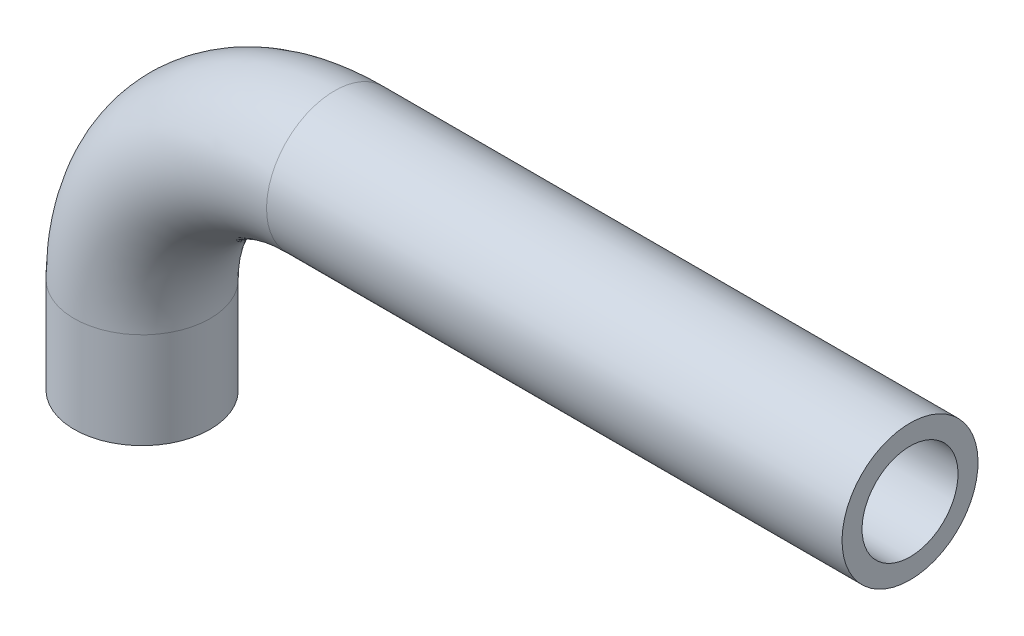
ISO-10303-21;
HEADER;
FILE_DESCRIPTION(('STEP AP214'),'2;1');
FILE_NAME('part.step','',(''),(''),'','','');
FILE_SCHEMA(('AUTOMOTIVE_DESIGN { 1 0 10303 214 1 1 1 1 }'));
ENDSEC;
DATA;
#1=APPLICATION_CONTEXT('core data for automotive mechanical design processes');
#2=APPLICATION_PROTOCOL_DEFINITION('international standard','automotive_design',2000,#1);
#3=PRODUCT_CONTEXT('',#1,'mechanical');
#4=PRODUCT('Part','Part','',(#3));
#5=PRODUCT_RELATED_PRODUCT_CATEGORY('part','',(#4));
#6=PRODUCT_DEFINITION_FORMATION('','',#4);
#7=PRODUCT_DEFINITION_CONTEXT('part definition',#1,'design');
#8=PRODUCT_DEFINITION('design','',#6,#7);
#9=PRODUCT_DEFINITION_SHAPE('','',#8);
#10=(LENGTH_UNIT() NAMED_UNIT(*) SI_UNIT(.MILLI.,.METRE.));
#11=(NAMED_UNIT(*) PLANE_ANGLE_UNIT() SI_UNIT($,.RADIAN.));
#12=(NAMED_UNIT(*) SI_UNIT($,.STERADIAN.) SOLID_ANGLE_UNIT());
#13=UNCERTAINTY_MEASURE_WITH_UNIT(LENGTH_MEASURE(1.E-05),#10,'distance_accuracy_value','');
#14=(GEOMETRIC_REPRESENTATION_CONTEXT(3) GLOBAL_UNCERTAINTY_ASSIGNED_CONTEXT((#13)) GLOBAL_UNIT_ASSIGNED_CONTEXT((#10,
#11,#12)) REPRESENTATION_CONTEXT('',''));
#15=CARTESIAN_POINT('',(0.,0.,0.));
#16=DIRECTION('',(0.,0.,1.));
#17=DIRECTION('',(1.,0.,0.));
#18=AXIS2_PLACEMENT_3D('',#15,#16,#17);
#19=CARTESIAN_POINT('',(0.,0.,0.));
#20=DIRECTION('',(0.,-1.,0.));
#21=DIRECTION('',(1.,0.,0.));
#22=AXIS2_PLACEMENT_3D('',#19,#20,#21);
#23=PLANE('',#22);
#24=CARTESIAN_POINT('',(0.,0.,0.));
#25=DIRECTION('',(0.,-1.,0.));
#26=DIRECTION('',(1.,0.,0.));
#27=AXIS2_PLACEMENT_3D('',#24,#25,#26);
#28=CIRCLE('',#27,9.525);
#29=CARTESIAN_POINT('',(9.52500000000001,0.,0.));
#30=VERTEX_POINT('',#29);
#31=EDGE_CURVE('E76',#30,#30,#28,.T.);
#32=ORIENTED_EDGE('',*,*,#31,.F.);
#33=EDGE_LOOP('',(#32));
#34=FACE_BOUND('',#33,.T.);
#35=CARTESIAN_POINT('',(0.,0.,0.));
#36=DIRECTION('',(0.,-1.,0.));
#37=DIRECTION('',(1.,0.,0.));
#38=AXIS2_PLACEMENT_3D('',#35,#36,#37);
#39=CIRCLE('',#38,13.49375);
#40=CARTESIAN_POINT('',(13.49375,0.,0.));
#41=VERTEX_POINT('',#40);
#42=EDGE_CURVE('E71',#41,#41,#39,.T.);
#43=ORIENTED_EDGE('',*,*,#42,.T.);
#44=EDGE_LOOP('',(#43));
#45=FACE_BOUND('',#44,.T.);
#46=ADVANCED_FACE('F57',(#34,#45),#23,.T.);
#47=CARTESIAN_POINT('',(152.4,57.0649731702334,0.));
#48=DIRECTION('',(-1.,0.,0.));
#49=DIRECTION('',(0.,-1.,0.));
#50=AXIS2_PLACEMENT_3D('',#47,#48,#49);
#51=PLANE('',#50);
#52=CARTESIAN_POINT('',(152.4,57.0649731702335,0.));
#53=DIRECTION('',(-1.,0.,0.));
#54=DIRECTION('',(0.,-1.,0.));
#55=AXIS2_PLACEMENT_3D('',#52,#53,#54);
#56=CIRCLE('',#55,9.525);
#57=CARTESIAN_POINT('',(152.4,47.5399731702335,0.));
#58=VERTEX_POINT('',#57);
#59=EDGE_CURVE('E79',#58,#58,#56,.T.);
#60=ORIENTED_EDGE('',*,*,#59,.T.);
#61=EDGE_LOOP('',(#60));
#62=FACE_BOUND('',#61,.T.);
#63=CARTESIAN_POINT('',(152.4,57.0649731702334,0.));
#64=DIRECTION('',(-1.,0.,0.));
#65=DIRECTION('',(0.,-1.,0.));
#66=AXIS2_PLACEMENT_3D('',#63,#64,#65);
#67=CIRCLE('',#66,13.49375);
#68=CARTESIAN_POINT('',(152.4,43.5712231702334,0.));
#69=VERTEX_POINT('',#68);
#70=EDGE_CURVE('E11',#69,#69,#67,.T.);
#71=ORIENTED_EDGE('',*,*,#70,.F.);
#72=EDGE_LOOP('',(#71));
#73=FACE_BOUND('',#72,.T.);
#74=ADVANCED_FACE('F89',(#62,#73),#51,.F.);
#75=CARTESIAN_POINT('',(0.,0.,0.));
#76=DIRECTION('',(0.,1.,0.));
#77=DIRECTION('',(0.,0.,1.));
#78=AXIS2_PLACEMENT_3D('',#75,#76,#77);
#79=CYLINDRICAL_SURFACE('',#78,13.49375);
#80=CARTESIAN_POINT('',(0.,19.05,0.));
#81=DIRECTION('',(0.,-1.,0.));
#82=DIRECTION('',(1.,0.,0.));
#83=AXIS2_PLACEMENT_3D('',#80,#81,#82);
#84=CIRCLE('',#83,13.49375);
#85=CARTESIAN_POINT('',(13.49375,19.05,0.));
#86=VERTEX_POINT('',#85);
#87=EDGE_CURVE('E67',#86,#86,#84,.T.);
#88=ORIENTED_EDGE('',*,*,#87,.T.);
#89=EDGE_LOOP('',(#88));
#90=FACE_BOUND('',#89,.T.);
#91=ORIENTED_EDGE('',*,*,#42,.F.);
#92=EDGE_LOOP('',(#91));
#93=FACE_BOUND('',#92,.T.);
#94=ADVANCED_FACE('F115',(#90,#93),#79,.T.);
#95=CARTESIAN_POINT('',(13.49375,19.05,0.));
#96=CARTESIAN_POINT('',(13.49375,19.134651748198,0.));
#97=CARTESIAN_POINT('',(13.4940311075767,19.1806667933308,0.));
#98=CARTESIAN_POINT('',(13.495156342369,19.3116122979597,0.));
#99=CARTESIAN_POINT('',(13.4960004695334,19.3771758186394,0.));
#100=CARTESIAN_POINT('',(13.4993783357401,19.5741194016248,0.));
#101=CARTESIAN_POINT('',(13.5027576418035,19.7057525032778,0.));
#102=CARTESIAN_POINT('',(13.5162824039429,20.1015089730374,0.));
#103=CARTESIAN_POINT('',(13.5298159899662,20.3664897221538,0.));
#104=CARTESIAN_POINT('',(13.5839583220982,21.1636122627878,0.));
#105=CARTESIAN_POINT('',(13.6381284808141,21.6979361546814,0.));
#106=CARTESIAN_POINT('',(13.8540586607707,23.2995442878418,0.));
#107=CARTESIAN_POINT('',(14.0694992107109,24.3652503192731,-2.13656084841867E-13));
#108=CARTESIAN_POINT('',(14.9107666695238,27.4689100424185,4.31874252325845E-13));
#109=CARTESIAN_POINT('',(15.7430148246696,29.4645507300147,0.));
#110=CARTESIAN_POINT('',(17.8972766212762,33.1750462801407,0.));
#111=CARTESIAN_POINT('',(19.2184947043395,34.8888102817614,0.));
#112=CARTESIAN_POINT('',(22.2602632242627,37.9170856357642,0.));
#113=CARTESIAN_POINT('',(23.979905262805,39.230691775179,0.));
#114=CARTESIAN_POINT('',(27.7000379718767,41.3684754900473,0.));
#115=CARTESIAN_POINT('',(29.7181017536252,42.1968338294901,0.));
#116=CARTESIAN_POINT('',(32.7974938659927,43.01680295554,0.));
#117=CARTESIAN_POINT('',(33.8491686365601,43.2224781971457,0.));
#118=CARTESIAN_POINT('',(35.4662186051258,43.4313450619827,0.));
#119=CARTESIAN_POINT('',(36.009396386761,43.4837915172417,0.));
#120=CARTESIAN_POINT('',(36.8254713339187,43.5362461709587,0.));
#121=CARTESIAN_POINT('',(37.0977129433841,43.5493662362709,0.));
#122=CARTESIAN_POINT('',(37.5057715598193,43.5624826283132,0.));
#123=CARTESIAN_POINT('',(37.6417403857863,43.5657610896119,0.));
#124=CARTESIAN_POINT('',(37.8455382617106,43.5690387934752,0.));
#125=CARTESIAN_POINT('',(37.9134449885064,43.5698580481925,0.));
#126=CARTESIAN_POINT('',(38.0491933729378,43.5709502365998,0.));
#127=CARTESIAN_POINT('',(38.0989294256308,43.5712231702334,0.));
#128=CARTESIAN_POINT('',(38.1848374995422,43.5712231702334,0.));
#129=CARTESIAN_POINT('',(13.49375,19.05,26.9875));
#130=CARTESIAN_POINT('',(13.49375,19.134651748198,26.9875));
#131=CARTESIAN_POINT('',(13.4940311075768,19.1806667933308,26.9875));
#132=CARTESIAN_POINT('',(13.495156342369,19.3116122979597,26.9875));
#133=CARTESIAN_POINT('',(13.4960004695334,19.3771758186394,26.9875));
#134=CARTESIAN_POINT('',(13.4993783357401,19.5741194016248,26.9875));
#135=CARTESIAN_POINT('',(13.5027576418035,19.7057525032778,26.9875));
#136=CARTESIAN_POINT('',(13.5162824039429,20.1015089730374,26.9875));
#137=CARTESIAN_POINT('',(13.5298159899662,20.3664897221538,26.9875));
#138=CARTESIAN_POINT('',(13.5839583220982,21.1636122627878,26.9875));
#139=CARTESIAN_POINT('',(13.6381284808141,21.6979361546814,26.9875));
#140=CARTESIAN_POINT('',(13.8540586607707,23.2995442878418,26.9875));
#141=CARTESIAN_POINT('',(14.0694992107109,24.3652503192731,26.9874999999998));
#142=CARTESIAN_POINT('',(14.9107666695238,27.4689100424185,26.9875000000004));
#143=CARTESIAN_POINT('',(15.7430148246696,29.4645507300147,26.9875));
#144=CARTESIAN_POINT('',(17.8972766212762,33.1750462801407,26.9875));
#145=CARTESIAN_POINT('',(19.2184947043395,34.8888102817614,26.9875));
#146=CARTESIAN_POINT('',(22.2602632242627,37.9170856357642,26.9875));
#147=CARTESIAN_POINT('',(23.979905262805,39.230691775179,26.9875));
#148=CARTESIAN_POINT('',(27.7000379718767,41.3684754900473,26.9875));
#149=CARTESIAN_POINT('',(29.7181017536253,42.1968338294901,26.9875));
#150=CARTESIAN_POINT('',(32.7974938659927,43.01680295554,26.9875));
#151=CARTESIAN_POINT('',(33.8491686365601,43.2224781971457,26.9875));
#152=CARTESIAN_POINT('',(35.4662186051258,43.4313450619827,26.9875));
#153=CARTESIAN_POINT('',(36.009396386761,43.4837915172417,26.9875));
#154=CARTESIAN_POINT('',(36.8254713339187,43.5362461709587,26.9875));
#155=CARTESIAN_POINT('',(37.0977129433841,43.5493662362709,26.9875));
#156=CARTESIAN_POINT('',(37.5057715598193,43.5624826283132,26.9875));
#157=CARTESIAN_POINT('',(37.6417403857863,43.5657610896119,26.9875));
#158=CARTESIAN_POINT('',(37.8455382617106,43.5690387934752,26.9875));
#159=CARTESIAN_POINT('',(37.9134449885064,43.5698580481925,26.9875));
#160=CARTESIAN_POINT('',(38.0491933729378,43.5709502365998,26.9875));
#161=CARTESIAN_POINT('',(38.0989294256308,43.5712231702334,26.9875));
#162=CARTESIAN_POINT('',(38.1848374995422,43.5712231702334,26.9875));
#163=CARTESIAN_POINT('',(-13.49375,19.05,26.9875));
#164=CARTESIAN_POINT('',(-13.49375,19.1733856258005,26.9875));
#165=CARTESIAN_POINT('',(-13.493135354318,19.3354329149464,26.9875));
#166=CARTESIAN_POINT('',(-13.4906844874868,19.6206444995794,26.9875));
#167=CARTESIAN_POINT('',(-13.4888482662324,19.7631757342356,26.9875));
#168=CARTESIAN_POINT('',(-13.481518372349,20.1905388933798,26.9875));
#169=CARTESIAN_POINT('',(-13.4742036147149,20.4751402305148,26.9875));
#170=CARTESIAN_POINT('',(-13.4450586673663,21.327968648855,26.9875));
#171=CARTESIAN_POINT('',(-13.4160300872345,21.8952196739615,26.9875));
#172=CARTESIAN_POINT('',(-13.3007359148809,23.5926638009169,26.9875));
#173=CARTESIAN_POINT('',(-13.1862970730335,24.7185463904678,26.9875));
#174=CARTESIAN_POINT('',(-12.7336576000601,28.0758865346446,26.9875));
#175=CARTESIAN_POINT('',(-12.2866086250207,30.2873723987179,26.9874999999998));
#176=CARTESIAN_POINT('',(-10.5221264857926,36.7970170741829,26.9875000000004));
#177=CARTESIAN_POINT('',(-8.77744573488835,40.9801126146243,26.9875));
#178=CARTESIAN_POINT('',(-4.26044519368868,48.760183929137,26.9875));
#179=CARTESIAN_POINT('',(-1.49014921300578,52.3535600617504,26.9875));
#180=CARTESIAN_POINT('',(4.88775252225681,58.7031696748838,26.9875));
#181=CARTESIAN_POINT('',(8.49345357082615,61.4575051285936,26.9875));
#182=CARTESIAN_POINT('',(16.2937318318172,65.9399548532194,26.9875));
#183=CARTESIAN_POINT('',(20.4660314119432,67.6610926479782,26.9875));
#184=CARTESIAN_POINT('',(27.0116192960458,69.4040262652266,26.9875));
#185=CARTESIAN_POINT('',(29.2401122858534,69.838842073338,26.9875));
#186=CARTESIAN_POINT('',(32.5850503108807,70.2708922463126,26.9875));
#187=CARTESIAN_POINT('',(33.7028539629923,70.3787264331392,26.9875));
#188=CARTESIAN_POINT('',(35.3820974386863,70.4866627634176,26.9875));
#189=CARTESIAN_POINT('',(35.9422696713328,70.5136644789465,26.9875));
#190=CARTESIAN_POINT('',(36.7829597954491,70.5406871193322,26.9875));
#191=CARTESIAN_POINT('',(37.0632618234476,70.5474475095438,26.9875));
#192=CARTESIAN_POINT('',(37.4837972935998,70.554211028184,26.9875));
#193=CARTESIAN_POINT('',(37.6239895211949,70.5559026582811,26.9875));
#194=CARTESIAN_POINT('',(37.9043971795583,70.5581587292767,26.9875));
#195=CARTESIAN_POINT('',(38.0627182155667,70.5587231702334,26.9875));
#196=CARTESIAN_POINT('',(38.1848374995422,70.5587231702334,26.9875));
#197=CARTESIAN_POINT('',(-13.49375,19.05,0.));
#198=CARTESIAN_POINT('',(-13.49375,19.1733856258005,0.));
#199=CARTESIAN_POINT('',(-13.493135354318,19.3354329149464,0.));
#200=CARTESIAN_POINT('',(-13.4906844874868,19.6206444995794,0.));
#201=CARTESIAN_POINT('',(-13.4888482662324,19.7631757342356,0.));
#202=CARTESIAN_POINT('',(-13.481518372349,20.1905388933798,0.));
#203=CARTESIAN_POINT('',(-13.4742036147149,20.4751402305148,0.));
#204=CARTESIAN_POINT('',(-13.4450586673663,21.327968648855,0.));
#205=CARTESIAN_POINT('',(-13.4160300872345,21.8952196739615,0.));
#206=CARTESIAN_POINT('',(-13.3007359148809,23.5926638009169,0.));
#207=CARTESIAN_POINT('',(-13.1862970730335,24.7185463904678,0.));
#208=CARTESIAN_POINT('',(-12.7336576000601,28.0758865346446,0.));
#209=CARTESIAN_POINT('',(-12.2866086250207,30.2873723987179,-2.12003577067267E-13));
#210=CARTESIAN_POINT('',(-10.5221264857926,36.7970170741829,4.33526760100444E-13));
#211=CARTESIAN_POINT('',(-8.77744573488835,40.9801126146243,0.));
#212=CARTESIAN_POINT('',(-4.26044519368868,48.760183929137,0.));
#213=CARTESIAN_POINT('',(-1.49014921300578,52.3535600617504,0.));
#214=CARTESIAN_POINT('',(4.88775252225681,58.7031696748838,0.));
#215=CARTESIAN_POINT('',(8.49345357082615,61.4575051285936,0.));
#216=CARTESIAN_POINT('',(16.2937318318172,65.9399548532194,0.));
#217=CARTESIAN_POINT('',(20.4660314119432,67.6610926479782,0.));
#218=CARTESIAN_POINT('',(27.0116192960458,69.4040262652266,0.));
#219=CARTESIAN_POINT('',(29.2401122858534,69.838842073338,0.));
#220=CARTESIAN_POINT('',(32.5850503108807,70.2708922463126,0.));
#221=CARTESIAN_POINT('',(33.7028539629923,70.3787264331392,0.));
#222=CARTESIAN_POINT('',(35.3820974386863,70.4866627634176,0.));
#223=CARTESIAN_POINT('',(35.9422696713328,70.5136644789465,0.));
#224=CARTESIAN_POINT('',(36.7829597954491,70.5406871193322,0.));
#225=CARTESIAN_POINT('',(37.0632618234476,70.5474475095438,0.));
#226=CARTESIAN_POINT('',(37.4837972935998,70.554211028184,0.));
#227=CARTESIAN_POINT('',(37.6239895211949,70.5559026582811,0.));
#228=CARTESIAN_POINT('',(37.9043971795583,70.5581587292767,0.));
#229=CARTESIAN_POINT('',(38.0627182155667,70.5587231702334,0.));
#230=CARTESIAN_POINT('',(38.1848374995422,70.5587231702334,0.));
#231=CARTESIAN_POINT('',(-13.49375,19.05,-26.9875));
#232=CARTESIAN_POINT('',(-13.49375,19.1733856258005,-26.9875));
#233=CARTESIAN_POINT('',(-13.493135354318,19.3354329149464,-26.9875));
#234=CARTESIAN_POINT('',(-13.4906844874868,19.6206444995794,-26.9875));
#235=CARTESIAN_POINT('',(-13.4888482662324,19.7631757342356,-26.9875));
#236=CARTESIAN_POINT('',(-13.481518372349,20.1905388933798,-26.9875));
#237=CARTESIAN_POINT('',(-13.4742036147149,20.4751402305148,-26.9875));
#238=CARTESIAN_POINT('',(-13.4450586673663,21.327968648855,-26.9875));
#239=CARTESIAN_POINT('',(-13.4160300872345,21.8952196739615,-26.9875));
#240=CARTESIAN_POINT('',(-13.3007359148809,23.5926638009169,-26.9875));
#241=CARTESIAN_POINT('',(-13.1862970730335,24.7185463904678,-26.9875));
#242=CARTESIAN_POINT('',(-12.7336576000601,28.0758865346446,-26.9875));
#243=CARTESIAN_POINT('',(-12.2866086250207,30.2873723987179,-26.9875000000002));
#244=CARTESIAN_POINT('',(-10.5221264857926,36.7970170741829,-26.9874999999996));
#245=CARTESIAN_POINT('',(-8.77744573488835,40.9801126146243,-26.9875));
#246=CARTESIAN_POINT('',(-4.26044519368868,48.760183929137,-26.9875));
#247=CARTESIAN_POINT('',(-1.49014921300578,52.3535600617504,-26.9875));
#248=CARTESIAN_POINT('',(4.88775252225681,58.7031696748838,-26.9875));
#249=CARTESIAN_POINT('',(8.49345357082615,61.4575051285936,-26.9875));
#250=CARTESIAN_POINT('',(16.2937318318172,65.9399548532194,-26.9875));
#251=CARTESIAN_POINT('',(20.4660314119432,67.6610926479782,-26.9875));
#252=CARTESIAN_POINT('',(27.0116192960458,69.4040262652266,-26.9875));
#253=CARTESIAN_POINT('',(29.2401122858534,69.838842073338,-26.9875));
#254=CARTESIAN_POINT('',(32.5850503108807,70.2708922463126,-26.9875));
#255=CARTESIAN_POINT('',(33.7028539629923,70.3787264331392,-26.9875));
#256=CARTESIAN_POINT('',(35.3820974386863,70.4866627634176,-26.9875));
#257=CARTESIAN_POINT('',(35.9422696713328,70.5136644789465,-26.9875));
#258=CARTESIAN_POINT('',(36.7829597954491,70.5406871193322,-26.9875));
#259=CARTESIAN_POINT('',(37.0632618234476,70.5474475095438,-26.9875));
#260=CARTESIAN_POINT('',(37.4837972935998,70.554211028184,-26.9875));
#261=CARTESIAN_POINT('',(37.6239895211949,70.5559026582811,-26.9875));
#262=CARTESIAN_POINT('',(37.9043971795583,70.5581587292767,-26.9875));
#263=CARTESIAN_POINT('',(38.0627182155667,70.5587231702334,-26.9875));
#264=CARTESIAN_POINT('',(38.1848374995422,70.5587231702334,-26.9875));
#265=CARTESIAN_POINT('',(13.49375,19.05,-26.9875));
#266=CARTESIAN_POINT('',(13.49375,19.134651748198,-26.9875));
#267=CARTESIAN_POINT('',(13.4940311075768,19.1806667933308,-26.9875));
#268=CARTESIAN_POINT('',(13.495156342369,19.3116122979597,-26.9875));
#269=CARTESIAN_POINT('',(13.4960004695334,19.3771758186394,-26.9875));
#270=CARTESIAN_POINT('',(13.4993783357401,19.5741194016248,-26.9875));
#271=CARTESIAN_POINT('',(13.5027576418035,19.7057525032778,-26.9875));
#272=CARTESIAN_POINT('',(13.5162824039429,20.1015089730374,-26.9875));
#273=CARTESIAN_POINT('',(13.5298159899662,20.3664897221538,-26.9875));
#274=CARTESIAN_POINT('',(13.5839583220982,21.1636122627878,-26.9875));
#275=CARTESIAN_POINT('',(13.6381284808141,21.6979361546814,-26.9875));
#276=CARTESIAN_POINT('',(13.8540586607707,23.2995442878418,-26.9875));
#277=CARTESIAN_POINT('',(14.0694992107109,24.3652503192731,-26.9875000000002));
#278=CARTESIAN_POINT('',(14.9107666695238,27.4689100424185,-26.9874999999996));
#279=CARTESIAN_POINT('',(15.7430148246696,29.4645507300147,-26.9875));
#280=CARTESIAN_POINT('',(17.8972766212762,33.1750462801407,-26.9875));
#281=CARTESIAN_POINT('',(19.2184947043395,34.8888102817614,-26.9875));
#282=CARTESIAN_POINT('',(22.2602632242627,37.9170856357642,-26.9875));
#283=CARTESIAN_POINT('',(23.979905262805,39.230691775179,-26.9875));
#284=CARTESIAN_POINT('',(27.7000379718767,41.3684754900473,-26.9875));
#285=CARTESIAN_POINT('',(29.7181017536253,42.1968338294901,-26.9875));
#286=CARTESIAN_POINT('',(32.7974938659927,43.01680295554,-26.9875));
#287=CARTESIAN_POINT('',(33.8491686365601,43.2224781971457,-26.9875));
#288=CARTESIAN_POINT('',(35.4662186051258,43.4313450619827,-26.9875));
#289=CARTESIAN_POINT('',(36.009396386761,43.4837915172417,-26.9875));
#290=CARTESIAN_POINT('',(36.8254713339187,43.5362461709587,-26.9875));
#291=CARTESIAN_POINT('',(37.0977129433841,43.5493662362709,-26.9875));
#292=CARTESIAN_POINT('',(37.5057715598193,43.5624826283132,-26.9875));
#293=CARTESIAN_POINT('',(37.6417403857863,43.5657610896119,-26.9875));
#294=CARTESIAN_POINT('',(37.8455382617106,43.5690387934752,-26.9875));
#295=CARTESIAN_POINT('',(37.9134449885064,43.5698580481925,-26.9875));
#296=CARTESIAN_POINT('',(38.0491933729378,43.5709502365998,-26.9875));
#297=CARTESIAN_POINT('',(38.0989294256308,43.5712231702334,-26.9875));
#298=CARTESIAN_POINT('',(38.1848374995422,43.5712231702334,-26.9875));
#299=CARTESIAN_POINT('',(13.49375,19.05,0.));
#300=CARTESIAN_POINT('',(13.49375,19.134651748198,0.));
#301=CARTESIAN_POINT('',(13.4940311075767,19.1806667933308,0.));
#302=CARTESIAN_POINT('',(13.495156342369,19.3116122979597,0.));
#303=CARTESIAN_POINT('',(13.4960004695334,19.3771758186394,0.));
#304=CARTESIAN_POINT('',(13.4993783357401,19.5741194016248,0.));
#305=CARTESIAN_POINT('',(13.5027576418035,19.7057525032778,0.));
#306=CARTESIAN_POINT('',(13.5162824039429,20.1015089730374,0.));
#307=CARTESIAN_POINT('',(13.5298159899662,20.3664897221538,0.));
#308=CARTESIAN_POINT('',(13.5839583220982,21.1636122627878,0.));
#309=CARTESIAN_POINT('',(13.6381284808141,21.6979361546814,0.));
#310=CARTESIAN_POINT('',(13.8540586607707,23.2995442878418,0.));
#311=CARTESIAN_POINT('',(14.0694992107109,24.3652503192731,-2.13656084841867E-13));
#312=CARTESIAN_POINT('',(14.9107666695238,27.4689100424185,4.31874252325845E-13));
#313=CARTESIAN_POINT('',(15.7430148246696,29.4645507300147,0.));
#314=CARTESIAN_POINT('',(17.8972766212762,33.1750462801407,0.));
#315=CARTESIAN_POINT('',(19.2184947043395,34.8888102817614,0.));
#316=CARTESIAN_POINT('',(22.2602632242627,37.9170856357642,0.));
#317=CARTESIAN_POINT('',(23.979905262805,39.230691775179,0.));
#318=CARTESIAN_POINT('',(27.7000379718767,41.3684754900473,0.));
#319=CARTESIAN_POINT('',(29.7181017536252,42.1968338294901,0.));
#320=CARTESIAN_POINT('',(32.7974938659927,43.01680295554,0.));
#321=CARTESIAN_POINT('',(33.8491686365601,43.2224781971457,0.));
#322=CARTESIAN_POINT('',(35.4662186051258,43.4313450619827,0.));
#323=CARTESIAN_POINT('',(36.009396386761,43.4837915172417,0.));
#324=CARTESIAN_POINT('',(36.8254713339187,43.5362461709587,0.));
#325=CARTESIAN_POINT('',(37.0977129433841,43.5493662362709,0.));
#326=CARTESIAN_POINT('',(37.5057715598193,43.5624826283132,0.));
#327=CARTESIAN_POINT('',(37.6417403857863,43.5657610896119,0.));
#328=CARTESIAN_POINT('',(37.8455382617106,43.5690387934752,0.));
#329=CARTESIAN_POINT('',(37.9134449885064,43.5698580481925,0.));
#330=CARTESIAN_POINT('',(38.0491933729378,43.5709502365998,0.));
#331=CARTESIAN_POINT('',(38.0989294256308,43.5712231702334,0.));
#332=CARTESIAN_POINT('',(38.1848374995422,43.5712231702334,0.));
#333=(BOUNDED_SURFACE() B_SPLINE_SURFACE(3,3,((#95,#96,#97,#98,#99,#100,#101,#102,#103,#104,
#105,#106,#107,#108,#109,#110,#111,#112,#113,#114,#115,#116,#117,#118,#119,#120,#121,#122,#123,
#124,#125,#126,#127,#128),(#129,#130,#131,#132,#133,#134,#135,#136,#137,#138,#139,#140,#141,
#142,#143,#144,#145,#146,#147,#148,#149,#150,#151,#152,#153,#154,#155,#156,#157,#158,#159,#160,
#161,#162),(#163,#164,#165,#166,#167,#168,#169,#170,#171,#172,#173,#174,#175,#176,#177,#178,
#179,#180,#181,#182,#183,#184,#185,#186,#187,#188,#189,#190,#191,#192,#193,#194,#195,#196),
(#197,#198,#199,#200,#201,#202,#203,#204,#205,#206,#207,#208,#209,#210,#211,#212,#213,#214,#215,
#216,#217,#218,#219,#220,#221,#222,#223,#224,#225,#226,#227,#228,#229,#230),(#231,#232,#233,
#234,#235,#236,#237,#238,#239,#240,#241,#242,#243,#244,#245,#246,#247,#248,#249,#250,#251,#252,
#253,#254,#255,#256,#257,#258,#259,#260,#261,#262,#263,#264),(#265,#266,#267,#268,#269,#270,
#271,#272,#273,#274,#275,#276,#277,#278,#279,#280,#281,#282,#283,#284,#285,#286,#287,#288,#289,
#290,#291,#292,#293,#294,#295,#296,#297,#298),(#299,#300,#301,#302,#303,#304,#305,#306,#307,
#308,#309,#310,#311,#312,#313,#314,#315,#316,#317,#318,#319,#320,#321,#322,#323,#324,#325,#326,
#327,#328,#329,#330,#331,#332)),.UNSPECIFIED.,.T.,.F.,.F.) B_SPLINE_SURFACE_WITH_KNOTS((4,3,4),
(4,2,2,2,2,2,2,2,2,2,2,2,2,2,2,2,4),(0.,0.5,1.),(0.0986473580104105,0.100265635548282,
0.101883913086154,0.105120468161897,0.111593578313383,0.124539798616356,0.150432239222301,
0.202017998011833,0.253603756801364,0.305189515590896,0.356775274380427,0.382665221825388,
0.395610195547868,0.402082682409108,0.405318925839728,0.406937047555038,0.408555169270348),
.UNSPECIFIED.) GEOMETRIC_REPRESENTATION_ITEM() RATIONAL_B_SPLINE_SURFACE(((1.,1.,1.,1.,1.,1.,1.,
1.,1.,1.,1.,1.,1.,1.,1.,1.,1.,1.,1.,1.,1.,1.,1.,1.,1.,1.,1.,1.,1.,1.,1.,1.,1.,1.),
(0.333333333333333,0.333333333333333,0.333333333333333,0.333333333333333,0.333333333333333,
0.333333333333333,0.333333333333333,0.333333333333333,0.333333333333333,0.333333333333333,
0.333333333333333,0.333333333333333,0.333333333333333,0.333333333333333,0.333333333333333,
0.333333333333333,0.333333333333333,0.333333333333333,0.333333333333333,0.333333333333333,
0.333333333333333,0.333333333333333,0.333333333333333,0.333333333333333,0.333333333333333,
0.333333333333333,0.333333333333333,0.333333333333333,0.333333333333333,0.333333333333333,
0.333333333333333,0.333333333333333,0.333333333333333,0.333333333333333),(0.333333333333333,
0.333333333333333,0.333333333333333,0.333333333333333,0.333333333333333,0.333333333333333,
0.333333333333333,0.333333333333333,0.333333333333333,0.333333333333333,0.333333333333333,
0.333333333333333,0.333333333333333,0.333333333333333,0.333333333333333,0.333333333333333,
0.333333333333333,0.333333333333333,0.333333333333333,0.333333333333333,0.333333333333333,
0.333333333333333,0.333333333333333,0.333333333333333,0.333333333333333,0.333333333333333,
0.333333333333333,0.333333333333333,0.333333333333333,0.333333333333333,0.333333333333333,
0.333333333333333,0.333333333333333,0.333333333333333),(1.,1.,1.,1.,1.,1.,1.,1.,1.,1.,1.,1.,1.,
1.,1.,1.,1.,1.,1.,1.,1.,1.,1.,1.,1.,1.,1.,1.,1.,1.,1.,1.,1.,1.),(0.333333333333333,
0.333333333333333,0.333333333333333,0.333333333333333,0.333333333333333,0.333333333333333,
0.333333333333333,0.333333333333333,0.333333333333333,0.333333333333333,0.333333333333333,
0.333333333333333,0.333333333333333,0.333333333333333,0.333333333333333,0.333333333333333,
0.333333333333333,0.333333333333333,0.333333333333333,0.333333333333333,0.333333333333333,
0.333333333333333,0.333333333333333,0.333333333333333,0.333333333333333,0.333333333333333,
0.333333333333333,0.333333333333333,0.333333333333333,0.333333333333333,0.333333333333333,
0.333333333333333,0.333333333333333,0.333333333333333),(0.333333333333333,0.333333333333333,
0.333333333333333,0.333333333333333,0.333333333333333,0.333333333333333,0.333333333333333,
0.333333333333333,0.333333333333333,0.333333333333333,0.333333333333333,0.333333333333333,
0.333333333333333,0.333333333333333,0.333333333333333,0.333333333333333,0.333333333333333,
0.333333333333333,0.333333333333333,0.333333333333333,0.333333333333333,0.333333333333333,
0.333333333333333,0.333333333333333,0.333333333333333,0.333333333333333,0.333333333333333,
0.333333333333333,0.333333333333333,0.333333333333333,0.333333333333333,0.333333333333333,
0.333333333333333,0.333333333333333),(1.,1.,1.,1.,1.,1.,1.,1.,1.,1.,1.,1.,1.,1.,1.,1.,1.,1.,1.,
1.,1.,1.,1.,1.,1.,1.,1.,1.,1.,1.,1.,1.,1.,1.))) REPRESENTATION_ITEM('') SURFACE());
#334=CARTESIAN_POINT('',(38.1848374995422,57.0649731702334,0.));
#335=DIRECTION('',(-1.,0.,0.));
#336=DIRECTION('',(0.,-1.,0.));
#337=AXIS2_PLACEMENT_3D('',#334,#335,#336);
#338=CIRCLE('',#337,13.49375);
#339=CARTESIAN_POINT('',(38.1848374995422,43.5712231702334,0.));
#340=VERTEX_POINT('',#339);
#341=EDGE_CURVE('E63',#340,#340,#338,.T.);
#342=ORIENTED_EDGE('',*,*,#341,.T.);
#343=EDGE_LOOP('',(#342));
#344=FACE_BOUND('',#343,.T.);
#345=ORIENTED_EDGE('',*,*,#87,.F.);
#346=EDGE_LOOP('',(#345));
#347=FACE_BOUND('',#346,.T.);
#348=ADVANCED_FACE('F117',(#344,#347),#333,.F.);
#349=CARTESIAN_POINT('',(38.1848374995422,57.0649731702334,0.));
#350=DIRECTION('',(1.,0.,0.));
#351=DIRECTION('',(0.,1.,0.));
#352=AXIS2_PLACEMENT_3D('',#349,#350,#351);
#353=CYLINDRICAL_SURFACE('',#352,13.49375);
#354=ORIENTED_EDGE('',*,*,#70,.T.);
#355=EDGE_LOOP('',(#354));
#356=FACE_BOUND('',#355,.T.);
#357=ORIENTED_EDGE('',*,*,#341,.F.);
#358=EDGE_LOOP('',(#357));
#359=FACE_BOUND('',#358,.T.);
#360=ADVANCED_FACE('F107',(#356,#359),#353,.T.);
#361=CARTESIAN_POINT('',(0.,-1.,0.));
#362=DIRECTION('',(0.,1.,0.));
#363=DIRECTION('',(0.,0.,1.));
#364=AXIS2_PLACEMENT_3D('',#361,#362,#363);
#365=CYLINDRICAL_SURFACE('',#364,9.525);
#366=CARTESIAN_POINT('',(0.,19.05,0.));
#367=DIRECTION('',(0.,-1.,0.));
#368=DIRECTION('',(1.,0.,0.));
#369=AXIS2_PLACEMENT_3D('',#366,#367,#368);
#370=CIRCLE('',#369,9.525);
#371=CARTESIAN_POINT('',(9.52500000000001,19.05,0.));
#372=VERTEX_POINT('',#371);
#373=EDGE_CURVE('E80',#372,#372,#370,.T.);
#374=ORIENTED_EDGE('',*,*,#373,.F.);
#375=EDGE_LOOP('',(#374));
#376=FACE_BOUND('',#375,.T.);
#377=ORIENTED_EDGE('',*,*,#31,.T.);
#378=EDGE_LOOP('',(#377));
#379=FACE_BOUND('',#378,.T.);
#380=ADVANCED_FACE('F97',(#376,#379),#365,.F.);
#381=CARTESIAN_POINT('',(9.52500000000001,19.05,0.));
#382=CARTESIAN_POINT('',(9.52500000000001,19.1403479066689,0.));
#383=CARTESIAN_POINT('',(9.52533015729816,19.2034265170989,0.));
#384=CARTESIAN_POINT('',(9.52665033797842,19.3570582099614,0.));
#385=CARTESIAN_POINT('',(9.52764036133299,19.4339405121119,0.));
#386=CARTESIAN_POINT('',(9.53159940807915,19.6647693268777,0.));
#387=CARTESIAN_POINT('',(9.53555745702067,19.8188977572914,0.));
#388=CARTESIAN_POINT('',(9.55137930522236,20.2818706900529,0.));
#389=CARTESIAN_POINT('',(9.56719156684812,20.5913029503485,0.));
#390=CARTESIAN_POINT('',(9.63032681666072,21.520825724302,0.));
#391=CARTESIAN_POINT('',(9.69336001701373,22.1421435423001,0.));
#392=CARTESIAN_POINT('',(9.94410038711755,24.0019475594243,0.));
#393=CARTESIAN_POINT('',(10.1936009995717,25.2361506250774,-2.13656084841947E-13));
#394=CARTESIAN_POINT('',(11.8211545316434,31.2406291210634,8.61674796534506E-13));
#395=CARTESIAN_POINT('',(14.4069177202505,35.6988024062826,0.));
#396=CARTESIAN_POINT('',(19.7054822386038,40.9738627003457,0.));
#397=CARTESIAN_POINT('',(21.7024858963116,42.4993407977773,0.));
#398=CARTESIAN_POINT('',(26.0226400101291,44.9819283375352,0.));
#399=CARTESIAN_POINT('',(28.3575031739007,45.9415777733618,0.));
#400=CARTESIAN_POINT('',(31.9466299586804,46.8972769716822,0.));
#401=CARTESIAN_POINT('',(33.1713662320364,47.1366493553923,0.));
#402=CARTESIAN_POINT('',(35.0425173853878,47.3783372949809,0.));
#403=CARTESIAN_POINT('',(35.6701989714894,47.4389290048704,0.));
#404=CARTESIAN_POINT('',(36.6132104669784,47.4995427286749,0.));
#405=CARTESIAN_POINT('',(36.9277948151399,47.5147042131345,0.));
#406=CARTESIAN_POINT('',(37.3994757121185,47.5298656416985,0.));
#407=CARTESIAN_POINT('',(37.5566700089747,47.5336561513669,0.));
#408=CARTESIAN_POINT('',(37.7923410605165,47.5374464750499,0.));
#409=CARTESIAN_POINT('',(37.8708780080183,47.5383940202637,0.));
#410=CARTESIAN_POINT('',(38.0278998150891,47.5396573678764,0.));
#411=CARTESIAN_POINT('',(38.0936042476802,47.5399731702334,0.));
#412=CARTESIAN_POINT('',(38.1848374995422,47.5399731702334,0.));
#413=CARTESIAN_POINT('',(9.52500000000001,19.05,19.05));
#414=CARTESIAN_POINT('',(9.52500000000001,19.1403479066689,19.05));
#415=CARTESIAN_POINT('',(9.52533015729816,19.2034265170989,19.05));
#416=CARTESIAN_POINT('',(9.52665033797842,19.3570582099614,19.05));
#417=CARTESIAN_POINT('',(9.52764036133299,19.4339405121119,19.05));
#418=CARTESIAN_POINT('',(9.53159940807915,19.6647693268777,19.05));
#419=CARTESIAN_POINT('',(9.53555745702067,19.8188977572914,19.05));
#420=CARTESIAN_POINT('',(9.55137930522236,20.2818706900529,19.05));
#421=CARTESIAN_POINT('',(9.56719156684812,20.5913029503485,19.05));
#422=CARTESIAN_POINT('',(9.63032681666072,21.520825724302,19.05));
#423=CARTESIAN_POINT('',(9.69336001701373,22.1421435423001,19.05));
#424=CARTESIAN_POINT('',(9.94410038711755,24.0019475594243,19.05));
#425=CARTESIAN_POINT('',(10.1936009995717,25.2361506250774,19.0499999999998));
#426=CARTESIAN_POINT('',(11.8211545316434,31.2406291210634,19.0500000000009));
#427=CARTESIAN_POINT('',(14.4069177202505,35.6988024062826,19.05));
#428=CARTESIAN_POINT('',(19.7054822386038,40.9738627003457,19.05));
#429=CARTESIAN_POINT('',(21.7024858963116,42.4993407977773,19.05));
#430=CARTESIAN_POINT('',(26.0226400101291,44.9819283375352,19.05));
#431=CARTESIAN_POINT('',(28.3575031739007,45.9415777733618,19.05));
#432=CARTESIAN_POINT('',(31.9466299586804,46.8972769716822,19.05));
#433=CARTESIAN_POINT('',(33.1713662320364,47.1366493553923,19.05));
#434=CARTESIAN_POINT('',(35.0425173853878,47.3783372949809,19.05));
#435=CARTESIAN_POINT('',(35.6701989714894,47.4389290048704,19.05));
#436=CARTESIAN_POINT('',(36.6132104669784,47.4995427286749,19.05));
#437=CARTESIAN_POINT('',(36.9277948151399,47.5147042131345,19.05));
#438=CARTESIAN_POINT('',(37.3994757121185,47.5298656416985,19.05));
#439=CARTESIAN_POINT('',(37.5566700089747,47.5336561513669,19.05));
#440=CARTESIAN_POINT('',(37.7923410605165,47.5374464750499,19.05));
#441=CARTESIAN_POINT('',(37.8708780080183,47.5383940202637,19.05));
#442=CARTESIAN_POINT('',(38.0278998150891,47.5396573678764,19.05));
#443=CARTESIAN_POINT('',(38.0936042476802,47.5399731702334,19.05));
#444=CARTESIAN_POINT('',(38.1848374995422,47.5399731702334,19.05));
#445=CARTESIAN_POINT('',(-9.525,19.05,19.05));
#446=CARTESIAN_POINT('',(-9.525,19.1676894673295,19.05));
#447=CARTESIAN_POINT('',(-9.52443440403866,19.3126731911812,19.05));
#448=CARTESIAN_POINT('',(-9.52217848309696,19.5751985875746,19.05));
#449=CARTESIAN_POINT('',(-9.5204881580309,19.7064110407686,19.05));
#450=CARTESIAN_POINT('',(-9.51373944469015,20.0998889681156,19.05));
#451=CARTESIAN_POINT('',(-9.50700342993351,20.3619949765135,19.05));
#452=CARTESIAN_POINT('',(-9.48015556864297,21.1476069318146,19.05));
#453=CARTESIAN_POINT('',(-9.45340566411928,21.6704064457448,19.05));
#454=CARTESIAN_POINT('',(-9.34710440943782,23.2354503394466,19.05));
#455=CARTESIAN_POINT('',(-9.24152860923427,24.2743390028402,19.05));
#456=CARTESIAN_POINT('',(-8.82369932640483,27.3734832630798,19.05));
#457=CARTESIAN_POINT('',(-8.41071041387612,29.4164720929586,19.0499999999998));
#458=CARTESIAN_POINT('',(-5.6975802467381,39.4259320543118,19.0500000000009));
#459=CARTESIAN_POINT('',(-1.38840735628966,46.8546254536969,19.05));
#460=CARTESIAN_POINT('',(7.44253350780556,55.6463926102842,19.05));
#461=CARTESIAN_POINT('',(10.7708729372224,58.188856106042,19.05));
#462=CARTESIAN_POINT('',(17.9711297936618,62.3265020056847,19.05));
#463=CARTESIAN_POINT('',(21.8266299915152,63.9163487041379,19.05));
#464=CARTESIAN_POINT('',(27.8624832034347,65.5235522490686,19.05));
#465=CARTESIAN_POINT('',(29.9179146903992,65.9246709150596,19.05));
#466=CARTESIAN_POINT('',(33.0087515306076,66.3239000133304,19.05));
#467=CARTESIAN_POINT('',(34.0420513782687,66.4235889455109,19.05));
#468=CARTESIAN_POINT('',(35.594358305624,66.5233662057013,19.05));
#469=CARTESIAN_POINT('',(36.11218779957,66.5483265020843,19.05));
#470=CARTESIAN_POINT('',(36.8892556431535,66.5733041059461,19.05));
#471=CARTESIAN_POINT('',(37.1483322002603,66.5795524477896,19.05));
#472=CARTESIAN_POINT('',(37.5369944947936,66.585803346609,19.05));
#473=CARTESIAN_POINT('',(37.6665565016831,66.5873666862077,19.05));
#474=CARTESIAN_POINT('',(37.925690737407,66.5894515980022,19.05));
#475=CARTESIAN_POINT('',(38.0680433935173,66.5899731702334,19.05));
#476=CARTESIAN_POINT('',(38.1848374995422,66.5899731702334,19.05));
#477=CARTESIAN_POINT('',(-9.525,19.05,0.));
#478=CARTESIAN_POINT('',(-9.525,19.1676894673295,0.));
#479=CARTESIAN_POINT('',(-9.52443440403866,19.3126731911812,0.));
#480=CARTESIAN_POINT('',(-9.52217848309696,19.5751985875746,0.));
#481=CARTESIAN_POINT('',(-9.5204881580309,19.7064110407686,0.));
#482=CARTESIAN_POINT('',(-9.51373944469015,20.0998889681156,0.));
#483=CARTESIAN_POINT('',(-9.50700342993351,20.3619949765135,0.));
#484=CARTESIAN_POINT('',(-9.48015556864297,21.1476069318146,0.));
#485=CARTESIAN_POINT('',(-9.45340566411928,21.6704064457448,0.));
#486=CARTESIAN_POINT('',(-9.34710440943782,23.2354503394466,0.));
#487=CARTESIAN_POINT('',(-9.24152860923427,24.2743390028402,0.));
#488=CARTESIAN_POINT('',(-8.82369932640483,27.3734832630798,0.));
#489=CARTESIAN_POINT('',(-8.41071041387612,29.4164720929586,-2.12489608765759E-13));
#490=CARTESIAN_POINT('',(-5.6975802467381,39.4259320543118,8.62841272610694E-13));
#491=CARTESIAN_POINT('',(-1.38840735628966,46.8546254536969,0.));
#492=CARTESIAN_POINT('',(7.44253350780556,55.6463926102842,0.));
#493=CARTESIAN_POINT('',(10.7708729372224,58.188856106042,0.));
#494=CARTESIAN_POINT('',(17.9711297936618,62.3265020056847,0.));
#495=CARTESIAN_POINT('',(21.8266299915152,63.9163487041379,0.));
#496=CARTESIAN_POINT('',(27.8624832034347,65.5235522490686,0.));
#497=CARTESIAN_POINT('',(29.9179146903992,65.9246709150596,0.));
#498=CARTESIAN_POINT('',(33.0087515306076,66.3239000133304,0.));
#499=CARTESIAN_POINT('',(34.0420513782687,66.4235889455109,0.));
#500=CARTESIAN_POINT('',(35.594358305624,66.5233662057013,0.));
#501=CARTESIAN_POINT('',(36.11218779957,66.5483265020843,0.));
#502=CARTESIAN_POINT('',(36.8892556431535,66.5733041059461,0.));
#503=CARTESIAN_POINT('',(37.1483322002603,66.5795524477896,0.));
#504=CARTESIAN_POINT('',(37.5369944947936,66.585803346609,0.));
#505=CARTESIAN_POINT('',(37.6665565016831,66.5873666862077,0.));
#506=CARTESIAN_POINT('',(37.925690737407,66.5894515980022,0.));
#507=CARTESIAN_POINT('',(38.0680433935173,66.5899731702334,0.));
#508=CARTESIAN_POINT('',(38.1848374995422,66.5899731702334,0.));
#509=CARTESIAN_POINT('',(-9.525,19.05,-19.05));
#510=CARTESIAN_POINT('',(-9.525,19.1676894673295,-19.05));
#511=CARTESIAN_POINT('',(-9.52443440403866,19.3126731911812,-19.05));
#512=CARTESIAN_POINT('',(-9.52217848309696,19.5751985875746,-19.05));
#513=CARTESIAN_POINT('',(-9.5204881580309,19.7064110407686,-19.05));
#514=CARTESIAN_POINT('',(-9.51373944469015,20.0998889681156,-19.05));
#515=CARTESIAN_POINT('',(-9.50700342993351,20.3619949765135,-19.05));
#516=CARTESIAN_POINT('',(-9.48015556864297,21.1476069318146,-19.05));
#517=CARTESIAN_POINT('',(-9.45340566411928,21.6704064457448,-19.05));
#518=CARTESIAN_POINT('',(-9.34710440943782,23.2354503394466,-19.05));
#519=CARTESIAN_POINT('',(-9.24152860923427,24.2743390028402,-19.05));
#520=CARTESIAN_POINT('',(-8.82369932640483,27.3734832630798,-19.05));
#521=CARTESIAN_POINT('',(-8.41071041387612,29.4164720929586,-19.0500000000002));
#522=CARTESIAN_POINT('',(-5.6975802467381,39.4259320543118,-19.0499999999991));
#523=CARTESIAN_POINT('',(-1.38840735628966,46.8546254536969,-19.05));
#524=CARTESIAN_POINT('',(7.44253350780556,55.6463926102842,-19.05));
#525=CARTESIAN_POINT('',(10.7708729372224,58.188856106042,-19.05));
#526=CARTESIAN_POINT('',(17.9711297936618,62.3265020056847,-19.05));
#527=CARTESIAN_POINT('',(21.8266299915152,63.9163487041379,-19.05));
#528=CARTESIAN_POINT('',(27.8624832034347,65.5235522490686,-19.05));
#529=CARTESIAN_POINT('',(29.9179146903992,65.9246709150596,-19.05));
#530=CARTESIAN_POINT('',(33.0087515306076,66.3239000133304,-19.05));
#531=CARTESIAN_POINT('',(34.0420513782687,66.4235889455109,-19.05));
#532=CARTESIAN_POINT('',(35.594358305624,66.5233662057013,-19.05));
#533=CARTESIAN_POINT('',(36.11218779957,66.5483265020843,-19.05));
#534=CARTESIAN_POINT('',(36.8892556431535,66.5733041059461,-19.05));
#535=CARTESIAN_POINT('',(37.1483322002603,66.5795524477896,-19.05));
#536=CARTESIAN_POINT('',(37.5369944947936,66.585803346609,-19.05));
#537=CARTESIAN_POINT('',(37.6665565016831,66.5873666862077,-19.05));
#538=CARTESIAN_POINT('',(37.925690737407,66.5894515980022,-19.05));
#539=CARTESIAN_POINT('',(38.0680433935173,66.5899731702334,-19.05));
#540=CARTESIAN_POINT('',(38.1848374995422,66.5899731702334,-19.05));
#541=CARTESIAN_POINT('',(9.52500000000001,19.05,-19.05));
#542=CARTESIAN_POINT('',(9.52500000000001,19.1403479066689,-19.05));
#543=CARTESIAN_POINT('',(9.52533015729816,19.2034265170989,-19.05));
#544=CARTESIAN_POINT('',(9.52665033797842,19.3570582099614,-19.05));
#545=CARTESIAN_POINT('',(9.52764036133299,19.4339405121119,-19.05));
#546=CARTESIAN_POINT('',(9.53159940807915,19.6647693268777,-19.05));
#547=CARTESIAN_POINT('',(9.53555745702067,19.8188977572914,-19.05));
#548=CARTESIAN_POINT('',(9.55137930522236,20.2818706900529,-19.05));
#549=CARTESIAN_POINT('',(9.56719156684812,20.5913029503485,-19.05));
#550=CARTESIAN_POINT('',(9.63032681666072,21.520825724302,-19.05));
#551=CARTESIAN_POINT('',(9.69336001701373,22.1421435423001,-19.05));
#552=CARTESIAN_POINT('',(9.94410038711755,24.0019475594243,-19.05));
#553=CARTESIAN_POINT('',(10.1936009995717,25.2361506250774,-19.0500000000002));
#554=CARTESIAN_POINT('',(11.8211545316434,31.2406291210634,-19.0499999999991));
#555=CARTESIAN_POINT('',(14.4069177202505,35.6988024062826,-19.05));
#556=CARTESIAN_POINT('',(19.7054822386038,40.9738627003457,-19.05));
#557=CARTESIAN_POINT('',(21.7024858963116,42.4993407977773,-19.05));
#558=CARTESIAN_POINT('',(26.0226400101291,44.9819283375352,-19.05));
#559=CARTESIAN_POINT('',(28.3575031739007,45.9415777733618,-19.05));
#560=CARTESIAN_POINT('',(31.9466299586804,46.8972769716822,-19.05));
#561=CARTESIAN_POINT('',(33.1713662320364,47.1366493553923,-19.05));
#562=CARTESIAN_POINT('',(35.0425173853878,47.3783372949809,-19.05));
#563=CARTESIAN_POINT('',(35.6701989714894,47.4389290048704,-19.05));
#564=CARTESIAN_POINT('',(36.6132104669784,47.4995427286749,-19.05));
#565=CARTESIAN_POINT('',(36.9277948151399,47.5147042131345,-19.05));
#566=CARTESIAN_POINT('',(37.3994757121185,47.5298656416985,-19.05));
#567=CARTESIAN_POINT('',(37.5566700089747,47.5336561513669,-19.05));
#568=CARTESIAN_POINT('',(37.7923410605165,47.5374464750499,-19.05));
#569=CARTESIAN_POINT('',(37.8708780080183,47.5383940202637,-19.05));
#570=CARTESIAN_POINT('',(38.0278998150891,47.5396573678764,-19.05));
#571=CARTESIAN_POINT('',(38.0936042476802,47.5399731702334,-19.05));
#572=CARTESIAN_POINT('',(38.1848374995422,47.5399731702334,-19.05));
#573=CARTESIAN_POINT('',(9.52500000000001,19.05,0.));
#574=CARTESIAN_POINT('',(9.52500000000001,19.1403479066689,0.));
#575=CARTESIAN_POINT('',(9.52533015729816,19.2034265170989,0.));
#576=CARTESIAN_POINT('',(9.52665033797842,19.3570582099614,0.));
#577=CARTESIAN_POINT('',(9.52764036133299,19.4339405121119,0.));
#578=CARTESIAN_POINT('',(9.53159940807915,19.6647693268777,0.));
#579=CARTESIAN_POINT('',(9.53555745702067,19.8188977572914,0.));
#580=CARTESIAN_POINT('',(9.55137930522236,20.2818706900529,0.));
#581=CARTESIAN_POINT('',(9.56719156684812,20.5913029503485,0.));
#582=CARTESIAN_POINT('',(9.63032681666072,21.520825724302,0.));
#583=CARTESIAN_POINT('',(9.69336001701373,22.1421435423001,0.));
#584=CARTESIAN_POINT('',(9.94410038711755,24.0019475594243,0.));
#585=CARTESIAN_POINT('',(10.1936009995717,25.2361506250774,-2.13656084841947E-13));
#586=CARTESIAN_POINT('',(11.8211545316434,31.2406291210634,8.61674796534506E-13));
#587=CARTESIAN_POINT('',(14.4069177202505,35.6988024062826,0.));
#588=CARTESIAN_POINT('',(19.7054822386038,40.9738627003457,0.));
#589=CARTESIAN_POINT('',(21.7024858963116,42.4993407977773,0.));
#590=CARTESIAN_POINT('',(26.0226400101291,44.9819283375352,0.));
#591=CARTESIAN_POINT('',(28.3575031739007,45.9415777733618,0.));
#592=CARTESIAN_POINT('',(31.9466299586804,46.8972769716822,0.));
#593=CARTESIAN_POINT('',(33.1713662320364,47.1366493553923,0.));
#594=CARTESIAN_POINT('',(35.0425173853878,47.3783372949809,0.));
#595=CARTESIAN_POINT('',(35.6701989714894,47.4389290048704,0.));
#596=CARTESIAN_POINT('',(36.6132104669784,47.4995427286749,0.));
#597=CARTESIAN_POINT('',(36.9277948151399,47.5147042131345,0.));
#598=CARTESIAN_POINT('',(37.3994757121185,47.5298656416985,0.));
#599=CARTESIAN_POINT('',(37.5566700089747,47.5336561513669,0.));
#600=CARTESIAN_POINT('',(37.7923410605165,47.5374464750499,0.));
#601=CARTESIAN_POINT('',(37.8708780080183,47.5383940202637,0.));
#602=CARTESIAN_POINT('',(38.0278998150891,47.5396573678764,0.));
#603=CARTESIAN_POINT('',(38.0936042476802,47.5399731702334,0.));
#604=CARTESIAN_POINT('',(38.1848374995422,47.5399731702334,0.));
#605=(BOUNDED_SURFACE() B_SPLINE_SURFACE(3,3,((#381,#382,#383,#384,#385,#386,#387,#388,#389,
#390,#391,#392,#393,#394,#395,#396,#397,#398,#399,#400,#401,#402,#403,#404,#405,#406,#407,#408,
#409,#410,#411,#412),(#413,#414,#415,#416,#417,#418,#419,#420,#421,#422,#423,#424,#425,#426,
#427,#428,#429,#430,#431,#432,#433,#434,#435,#436,#437,#438,#439,#440,#441,#442,#443,#444),
(#445,#446,#447,#448,#449,#450,#451,#452,#453,#454,#455,#456,#457,#458,#459,#460,#461,#462,#463,
#464,#465,#466,#467,#468,#469,#470,#471,#472,#473,#474,#475,#476),(#477,#478,#479,#480,#481,
#482,#483,#484,#485,#486,#487,#488,#489,#490,#491,#492,#493,#494,#495,#496,#497,#498,#499,#500,
#501,#502,#503,#504,#505,#506,#507,#508),(#509,#510,#511,#512,#513,#514,#515,#516,#517,#518,
#519,#520,#521,#522,#523,#524,#525,#526,#527,#528,#529,#530,#531,#532,#533,#534,#535,#536,#537,
#538,#539,#540),(#541,#542,#543,#544,#545,#546,#547,#548,#549,#550,#551,#552,#553,#554,#555,
#556,#557,#558,#559,#560,#561,#562,#563,#564,#565,#566,#567,#568,#569,#570,#571,#572),(#573,
#574,#575,#576,#577,#578,#579,#580,#581,#582,#583,#584,#585,#586,#587,#588,#589,#590,#591,#592,
#593,#594,#595,#596,#597,#598,#599,#600,#601,#602,#603,#604)),.UNSPECIFIED.,.T.,.F.,
.F.) B_SPLINE_SURFACE_WITH_KNOTS((4,3,4),(4,2,2,2,2,2,2,2,2,2,2,2,2,2,2,4),(0.,0.5,1.),
(0.102686616220219,0.104287139493831,0.105887662767443,0.109088709314667,0.115490802409115,
0.12829498859801,0.153903360975802,0.255942974821235,0.306962781743952,0.357982588666668,
0.383588495236162,0.396391448520908,0.402792925163282,0.405993663484468,0.407594032645062,
0.409194401805655),
.UNSPECIFIED.) GEOMETRIC_REPRESENTATION_ITEM() RATIONAL_B_SPLINE_SURFACE(((1.,1.,1.,1.,1.,1.,1.,
1.,1.,1.,1.,1.,1.,1.,1.,1.,1.,1.,1.,1.,1.,1.,1.,1.,1.,1.,1.,1.,1.,1.,1.,1.),(0.333333333333333,
0.333333333333333,0.333333333333333,0.333333333333333,0.333333333333333,0.333333333333333,
0.333333333333333,0.333333333333333,0.333333333333333,0.333333333333333,0.333333333333333,
0.333333333333333,0.333333333333333,0.333333333333333,0.333333333333333,0.333333333333333,
0.333333333333333,0.333333333333333,0.333333333333333,0.333333333333333,0.333333333333333,
0.333333333333333,0.333333333333333,0.333333333333333,0.333333333333333,0.333333333333333,
0.333333333333333,0.333333333333333,0.333333333333333,0.333333333333333,0.333333333333333,
0.333333333333333),(0.333333333333333,0.333333333333333,0.333333333333333,0.333333333333333,
0.333333333333333,0.333333333333333,0.333333333333333,0.333333333333333,0.333333333333333,
0.333333333333333,0.333333333333333,0.333333333333333,0.333333333333333,0.333333333333333,
0.333333333333333,0.333333333333333,0.333333333333333,0.333333333333333,0.333333333333333,
0.333333333333333,0.333333333333333,0.333333333333333,0.333333333333333,0.333333333333333,
0.333333333333333,0.333333333333333,0.333333333333333,0.333333333333333,0.333333333333333,
0.333333333333333,0.333333333333333,0.333333333333333),(1.,1.,1.,1.,1.,1.,1.,1.,1.,1.,1.,1.,1.,
1.,1.,1.,1.,1.,1.,1.,1.,1.,1.,1.,1.,1.,1.,1.,1.,1.,1.,1.),(0.333333333333333,0.333333333333333,
0.333333333333333,0.333333333333333,0.333333333333333,0.333333333333333,0.333333333333333,
0.333333333333333,0.333333333333333,0.333333333333333,0.333333333333333,0.333333333333333,
0.333333333333333,0.333333333333333,0.333333333333333,0.333333333333333,0.333333333333333,
0.333333333333333,0.333333333333333,0.333333333333333,0.333333333333333,0.333333333333333,
0.333333333333333,0.333333333333333,0.333333333333333,0.333333333333333,0.333333333333333,
0.333333333333333,0.333333333333333,0.333333333333333,0.333333333333333,0.333333333333333),
(0.333333333333333,0.333333333333333,0.333333333333333,0.333333333333333,0.333333333333333,
0.333333333333333,0.333333333333333,0.333333333333333,0.333333333333333,0.333333333333333,
0.333333333333333,0.333333333333333,0.333333333333333,0.333333333333333,0.333333333333333,
0.333333333333333,0.333333333333333,0.333333333333333,0.333333333333333,0.333333333333333,
0.333333333333333,0.333333333333333,0.333333333333333,0.333333333333333,0.333333333333333,
0.333333333333333,0.333333333333333,0.333333333333333,0.333333333333333,0.333333333333333,
0.333333333333333,0.333333333333333),(1.,1.,1.,1.,1.,1.,1.,1.,1.,1.,1.,1.,1.,1.,1.,1.,1.,1.,1.,
1.,1.,1.,1.,1.,1.,1.,1.,1.,1.,1.,1.,1.))) REPRESENTATION_ITEM('') SURFACE());
#606=CARTESIAN_POINT('',(38.1848374995422,57.0649731702334,0.));
#607=DIRECTION('',(-1.,0.,0.));
#608=DIRECTION('',(0.,-1.,0.));
#609=AXIS2_PLACEMENT_3D('',#606,#607,#608);
#610=CIRCLE('',#609,9.525);
#611=CARTESIAN_POINT('',(38.1848374995422,47.5399731702334,0.));
#612=VERTEX_POINT('',#611);
#613=EDGE_CURVE('E83',#612,#612,#610,.T.);
#614=ORIENTED_EDGE('',*,*,#613,.F.);
#615=EDGE_LOOP('',(#614));
#616=FACE_BOUND('',#615,.T.);
#617=ORIENTED_EDGE('',*,*,#373,.T.);
#618=EDGE_LOOP('',(#617));
#619=FACE_BOUND('',#618,.T.);
#620=ADVANCED_FACE('F95',(#616,#619),#605,.T.);
#621=CARTESIAN_POINT('',(38.1848374995422,57.0649731702334,0.));
#622=DIRECTION('',(1.,0.,0.));
#623=DIRECTION('',(0.,1.,0.));
#624=AXIS2_PLACEMENT_3D('',#621,#622,#623);
#625=CYLINDRICAL_SURFACE('',#624,9.525);
#626=ORIENTED_EDGE('',*,*,#59,.F.);
#627=EDGE_LOOP('',(#626));
#628=FACE_BOUND('',#627,.T.);
#629=ORIENTED_EDGE('',*,*,#613,.T.);
#630=EDGE_LOOP('',(#629));
#631=FACE_BOUND('',#630,.T.);
#632=ADVANCED_FACE('F92',(#628,#631),#625,.F.);
#633=CLOSED_SHELL('',(#46,#74,#94,#348,#360,#380,#620,#632));
#634=MANIFOLD_SOLID_BREP('B2',#633);
#635=ADVANCED_BREP_SHAPE_REPRESENTATION('',(#18,#634),#14);
#636=SHAPE_DEFINITION_REPRESENTATION(#9,#635);
ENDSEC;
END-ISO-10303-21;
